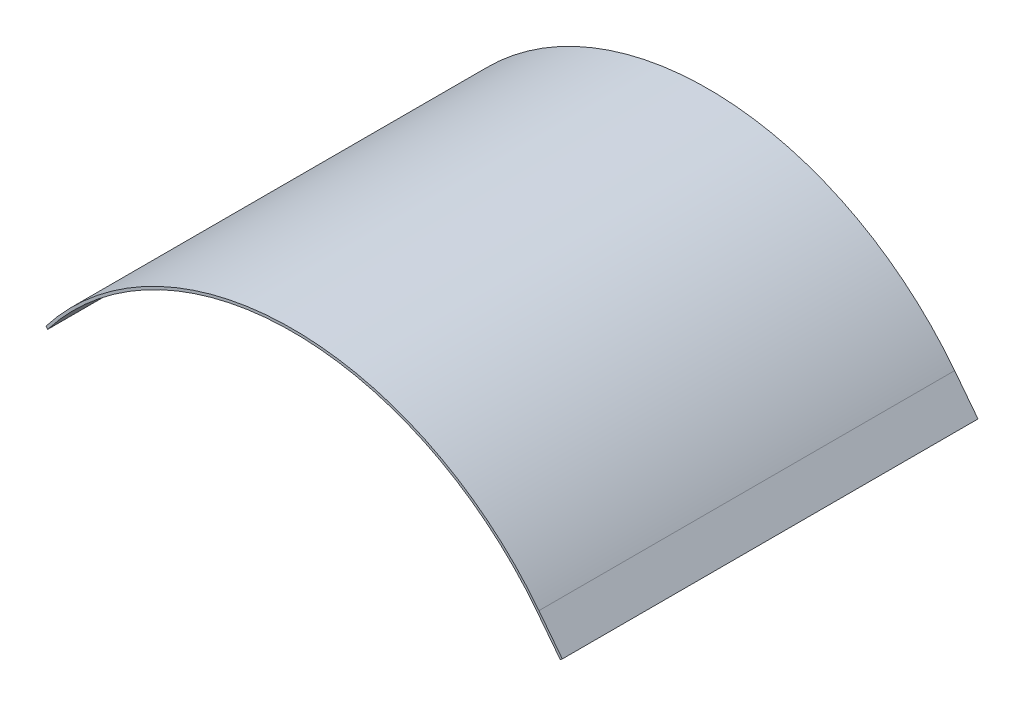
ISO-10303-21;
HEADER;
FILE_DESCRIPTION(('STEP AP214'),'2;1');
FILE_NAME('part.step','',(''),(''),'','','');
FILE_SCHEMA(('AUTOMOTIVE_DESIGN { 1 0 10303 214 1 1 1 1 }'));
ENDSEC;
DATA;
#1=APPLICATION_CONTEXT('core data for automotive mechanical design processes');
#2=APPLICATION_PROTOCOL_DEFINITION('international standard','automotive_design',2000,#1);
#3=PRODUCT_CONTEXT('',#1,'mechanical');
#4=PRODUCT('Part','Part','',(#3));
#5=PRODUCT_RELATED_PRODUCT_CATEGORY('part','',(#4));
#6=PRODUCT_DEFINITION_FORMATION('','',#4);
#7=PRODUCT_DEFINITION_CONTEXT('part definition',#1,'design');
#8=PRODUCT_DEFINITION('design','',#6,#7);
#9=PRODUCT_DEFINITION_SHAPE('','',#8);
#10=(LENGTH_UNIT() NAMED_UNIT(*) SI_UNIT(.MILLI.,.METRE.));
#11=(NAMED_UNIT(*) PLANE_ANGLE_UNIT() SI_UNIT($,.RADIAN.));
#12=(NAMED_UNIT(*) SI_UNIT($,.STERADIAN.) SOLID_ANGLE_UNIT());
#13=UNCERTAINTY_MEASURE_WITH_UNIT(LENGTH_MEASURE(1.E-05),#10,'distance_accuracy_value','');
#14=(GEOMETRIC_REPRESENTATION_CONTEXT(3) GLOBAL_UNCERTAINTY_ASSIGNED_CONTEXT((#13)) GLOBAL_UNIT_ASSIGNED_CONTEXT((#10,
#11,#12)) REPRESENTATION_CONTEXT('',''));
#15=CARTESIAN_POINT('',(0.,0.,0.));
#16=DIRECTION('',(0.,0.,1.));
#17=DIRECTION('',(1.,0.,0.));
#18=AXIS2_PLACEMENT_3D('',#15,#16,#17);
#19=CARTESIAN_POINT('',(0.,0.,1600.));
#20=DIRECTION('',(0.79057083333334,0.61237060468529,0.));
#21=DIRECTION('',(-0.61237060468529,0.79057083333334,0.));
#22=AXIS2_PLACEMENT_3D('',#19,#20,#21);
#23=PLANE('',#22);
#24=DIRECTION('',(0.61237060468529,-0.79057083333334,0.));
#25=VECTOR('',#24,1.);
#26=CARTESIAN_POINT('',(0.,0.,0.));
#27=LINE('',#26,#25);
#28=CARTESIAN_POINT('',(0.,0.,0.));
#29=VERTEX_POINT('',#28);
#30=CARTESIAN_POINT('',(6.32631661811814,-8.16727870745287,0.));
#31=VERTEX_POINT('',#30);
#32=EDGE_CURVE('E132',#29,#31,#27,.T.);
#33=ORIENTED_EDGE('',*,*,#32,.T.);
#34=DIRECTION('',(0.,0.,-1.));
#35=VECTOR('',#34,1.);
#36=CARTESIAN_POINT('',(6.32631661811814,-8.16727870745287,1600.));
#37=LINE('',#36,#35);
#38=CARTESIAN_POINT('',(6.32631661811814,-8.16727870745287,1600.));
#39=VERTEX_POINT('',#38);
#40=EDGE_CURVE('E11',#39,#31,#37,.T.);
#41=ORIENTED_EDGE('',*,*,#40,.F.);
#42=DIRECTION('',(0.61237060468529,-0.79057083333334,0.));
#43=VECTOR('',#42,1.);
#44=CARTESIAN_POINT('',(0.,0.,1600.));
#45=LINE('',#44,#43);
#46=CARTESIAN_POINT('',(0.,0.,1600.));
#47=VERTEX_POINT('',#46);
#48=EDGE_CURVE('E90',#47,#39,#45,.T.);
#49=ORIENTED_EDGE('',*,*,#48,.F.);
#50=DIRECTION('',(0.,0.,-1.));
#51=VECTOR('',#50,1.);
#52=CARTESIAN_POINT('',(0.,0.,1600.));
#53=LINE('',#52,#51);
#54=EDGE_CURVE('E56',#47,#29,#53,.T.);
#55=ORIENTED_EDGE('',*,*,#54,.T.);
#56=EDGE_LOOP('',(#33,#41,#49,#55));
#57=FACE_BOUND('',#56,.T.);
#58=ADVANCED_FACE('F39',(#57),#23,.F.);
#59=CARTESIAN_POINT('',(7.90570833333326,-6.12370604685308,1600.));
#60=DIRECTION('',(0.791234909195817,-0.611512320783389,0.));
#61=DIRECTION('',(0.611512320783389,0.791234909195817,0.));
#62=AXIS2_PLACEMENT_3D('',#59,#60,#61);
#63=PLANE('',#62);
#64=DIRECTION('',(-0.611512320783389,-0.791234909195817,0.));
#65=VECTOR('',#64,1.);
#66=CARTESIAN_POINT('',(7.90570833333326,-6.12370604685308,0.));
#67=LINE('',#66,#65);
#68=CARTESIAN_POINT('',(7.90570833333326,-6.12370604685308,0.));
#69=VERTEX_POINT('',#68);
#70=EDGE_CURVE('E135',#69,#31,#67,.T.);
#71=ORIENTED_EDGE('',*,*,#70,.F.);
#72=DIRECTION('',(0.,0.,-1.));
#73=VECTOR('',#72,1.);
#74=CARTESIAN_POINT('',(7.90570833333326,-6.12370604685308,1600.));
#75=LINE('',#74,#73);
#76=CARTESIAN_POINT('',(7.90570833333326,-6.12370604685308,1600.));
#77=VERTEX_POINT('',#76);
#78=EDGE_CURVE('E48',#77,#69,#75,.T.);
#79=ORIENTED_EDGE('',*,*,#78,.F.);
#80=DIRECTION('',(-0.611512320783389,-0.791234909195817,0.));
#81=VECTOR('',#80,1.);
#82=CARTESIAN_POINT('',(7.90570833333326,-6.12370604685308,1600.));
#83=LINE('',#82,#81);
#84=EDGE_CURVE('E178',#77,#39,#83,.T.);
#85=ORIENTED_EDGE('',*,*,#84,.T.);
#86=ORIENTED_EDGE('',*,*,#40,.T.);
#87=EDGE_LOOP('',(#71,#79,#85,#86));
#88=FACE_BOUND('',#87,.T.);
#89=ADVANCED_FACE('F177',(#88),#63,.T.);
#90=CARTESIAN_POINT('',(948.685,-734.844725622359,1600.));
#91=DIRECTION('',(0.,0.,-1.));
#92=DIRECTION('',(-1.,0.,0.));
#93=AXIS2_PLACEMENT_3D('',#90,#91,#92);
#94=CYLINDRICAL_SURFACE('',#93,1190.);
#95=CARTESIAN_POINT('',(948.685,-734.844725622359,0.));
#96=DIRECTION('',(0.,0.,-1.));
#97=DIRECTION('',(-1.,0.,0.));
#98=AXIS2_PLACEMENT_3D('',#95,#96,#97);
#99=CIRCLE('',#98,1190.);
#100=CARTESIAN_POINT('',(1889.46429166667,-6.12370604685297,0.));
#101=VERTEX_POINT('',#100);
#102=EDGE_CURVE('E139',#69,#101,#99,.T.);
#103=ORIENTED_EDGE('',*,*,#102,.T.);
#104=DIRECTION('',(0.,0.,-1.));
#105=VECTOR('',#104,1.);
#106=CARTESIAN_POINT('',(1889.46429166667,-6.12370604685297,1600.));
#107=LINE('',#106,#105);
#108=CARTESIAN_POINT('',(1889.46429166667,-6.12370604685297,1600.));
#109=VERTEX_POINT('',#108);
#110=EDGE_CURVE('E161',#109,#101,#107,.T.);
#111=ORIENTED_EDGE('',*,*,#110,.F.);
#112=CARTESIAN_POINT('',(948.685,-734.844725622359,1600.));
#113=DIRECTION('',(0.,0.,-1.));
#114=DIRECTION('',(-1.,0.,0.));
#115=AXIS2_PLACEMENT_3D('',#112,#113,#114);
#116=CIRCLE('',#115,1190.);
#117=EDGE_CURVE('E170',#77,#109,#116,.T.);
#118=ORIENTED_EDGE('',*,*,#117,.F.);
#119=ORIENTED_EDGE('',*,*,#78,.T.);
#120=EDGE_LOOP('',(#103,#111,#118,#119));
#121=FACE_BOUND('',#120,.T.);
#122=ADVANCED_FACE('F168',(#121),#94,.F.);
#123=CARTESIAN_POINT('',(1889.46429166667,-6.12370604685297,1600.));
#124=DIRECTION('',(0.790570833333333,0.612370604685299,0.));
#125=DIRECTION('',(-0.612370604685299,0.790570833333333,0.));
#126=AXIS2_PLACEMENT_3D('',#123,#124,#125);
#127=PLANE('',#126);
#128=DIRECTION('',(0.612370604685299,-0.790570833333333,0.));
#129=VECTOR('',#128,1.);
#130=CARTESIAN_POINT('',(1889.46429166667,-6.12370604685297,0.));
#131=LINE('',#130,#129);
#132=CARTESIAN_POINT('',(1979.4031623768,-122.23484433852,0.));
#133=VERTEX_POINT('',#132);
#134=EDGE_CURVE('E142',#101,#133,#131,.T.);
#135=ORIENTED_EDGE('',*,*,#134,.T.);
#136=DIRECTION('',(0.,0.,-1.));
#137=VECTOR('',#136,1.);
#138=CARTESIAN_POINT('',(1979.4031623768,-122.23484433852,1600.));
#139=LINE('',#138,#137);
#140=CARTESIAN_POINT('',(1979.4031623768,-122.23484433852,1600.));
#141=VERTEX_POINT('',#140);
#142=EDGE_CURVE('E114',#141,#133,#139,.T.);
#143=ORIENTED_EDGE('',*,*,#142,.F.);
#144=DIRECTION('',(0.612370604685299,-0.790570833333333,0.));
#145=VECTOR('',#144,1.);
#146=CARTESIAN_POINT('',(1889.46429166667,-6.12370604685297,1600.));
#147=LINE('',#146,#145);
#148=EDGE_CURVE('E120',#109,#141,#147,.T.);
#149=ORIENTED_EDGE('',*,*,#148,.F.);
#150=ORIENTED_EDGE('',*,*,#110,.T.);
#151=EDGE_LOOP('',(#135,#143,#149,#150));
#152=FACE_BOUND('',#151,.T.);
#153=ADVANCED_FACE('F196',(#152),#127,.F.);
#154=CARTESIAN_POINT('',(1987.30887071013,-116.111138291667,1600.));
#155=DIRECTION('',(0.612370604685296,-0.790570833333336,0.));
#156=DIRECTION('',(0.790570833333336,0.612370604685296,0.));
#157=AXIS2_PLACEMENT_3D('',#154,#155,#156);
#158=PLANE('',#157);
#159=DIRECTION('',(-0.790570833333336,-0.612370604685296,0.));
#160=VECTOR('',#159,1.);
#161=CARTESIAN_POINT('',(1987.30887071013,-116.111138291667,0.));
#162=LINE('',#161,#160);
#163=CARTESIAN_POINT('',(1987.30887071013,-116.111138291667,0.));
#164=VERTEX_POINT('',#163);
#165=EDGE_CURVE('E109',#164,#133,#162,.T.);
#166=ORIENTED_EDGE('',*,*,#165,.F.);
#167=DIRECTION('',(0.,0.,-1.));
#168=VECTOR('',#167,1.);
#169=CARTESIAN_POINT('',(1987.30887071013,-116.111138291667,1600.));
#170=LINE('',#169,#168);
#171=CARTESIAN_POINT('',(1987.30887071013,-116.111138291667,1600.));
#172=VERTEX_POINT('',#171);
#173=EDGE_CURVE('E104',#172,#164,#170,.T.);
#174=ORIENTED_EDGE('',*,*,#173,.F.);
#175=DIRECTION('',(-0.790570833333336,-0.612370604685296,0.));
#176=VECTOR('',#175,1.);
#177=CARTESIAN_POINT('',(1987.30887071013,-116.111138291667,1600.));
#178=LINE('',#177,#176);
#179=EDGE_CURVE('E107',#172,#141,#178,.T.);
#180=ORIENTED_EDGE('',*,*,#179,.T.);
#181=ORIENTED_EDGE('',*,*,#142,.T.);
#182=EDGE_LOOP('',(#166,#174,#180,#181));
#183=FACE_BOUND('',#182,.T.);
#184=ADVANCED_FACE('F106',(#183),#158,.T.);
#185=CARTESIAN_POINT('',(1897.37,0.,1600.));
#186=DIRECTION('',(0.790570833333333,0.612370604685299,0.));
#187=DIRECTION('',(-0.612370604685299,0.790570833333333,0.));
#188=AXIS2_PLACEMENT_3D('',#185,#186,#187);
#189=PLANE('',#188);
#190=DIRECTION('',(0.612370604685299,-0.790570833333333,0.));
#191=VECTOR('',#190,1.);
#192=CARTESIAN_POINT('',(1897.37,0.,0.));
#193=LINE('',#192,#191);
#194=CARTESIAN_POINT('',(1897.37,-1.11022302462516E-13,0.));
#195=VERTEX_POINT('',#194);
#196=EDGE_CURVE('E148',#195,#164,#193,.T.);
#197=ORIENTED_EDGE('',*,*,#196,.F.);
#198=DIRECTION('',(0.,0.,-1.));
#199=VECTOR('',#198,1.);
#200=CARTESIAN_POINT('',(1897.37,-1.11022302462516E-13,1600.));
#201=LINE('',#200,#199);
#202=CARTESIAN_POINT('',(1897.37,-1.11022302462516E-13,1600.));
#203=VERTEX_POINT('',#202);
#204=EDGE_CURVE('E78',#203,#195,#201,.T.);
#205=ORIENTED_EDGE('',*,*,#204,.F.);
#206=DIRECTION('',(0.612370604685299,-0.790570833333333,0.));
#207=VECTOR('',#206,1.);
#208=CARTESIAN_POINT('',(1897.37,0.,1600.));
#209=LINE('',#208,#207);
#210=EDGE_CURVE('E118',#203,#172,#209,.T.);
#211=ORIENTED_EDGE('',*,*,#210,.T.);
#212=ORIENTED_EDGE('',*,*,#173,.T.);
#213=EDGE_LOOP('',(#197,#205,#211,#212));
#214=FACE_BOUND('',#213,.T.);
#215=ADVANCED_FACE('F124',(#214),#189,.T.);
#216=CARTESIAN_POINT('',(948.685,-734.844725622359,1600.));
#217=DIRECTION('',(0.,0.,-1.));
#218=DIRECTION('',(-1.,0.,0.));
#219=AXIS2_PLACEMENT_3D('',#216,#217,#218);
#220=CYLINDRICAL_SURFACE('',#219,1200.);
#221=CARTESIAN_POINT('',(948.685,-734.844725622359,0.));
#222=DIRECTION('',(0.,0.,-1.));
#223=DIRECTION('',(-1.,0.,0.));
#224=AXIS2_PLACEMENT_3D('',#221,#222,#223);
#225=CIRCLE('',#224,1200.);
#226=EDGE_CURVE('E151',#29,#195,#225,.T.);
#227=ORIENTED_EDGE('',*,*,#226,.F.);
#228=ORIENTED_EDGE('',*,*,#54,.F.);
#229=CARTESIAN_POINT('',(948.685,-734.844725622359,1600.));
#230=DIRECTION('',(0.,0.,-1.));
#231=DIRECTION('',(-1.,0.,0.));
#232=AXIS2_PLACEMENT_3D('',#229,#230,#231);
#233=CIRCLE('',#232,1200.);
#234=EDGE_CURVE('E126',#47,#203,#233,.T.);
#235=ORIENTED_EDGE('',*,*,#234,.T.);
#236=ORIENTED_EDGE('',*,*,#204,.T.);
#237=EDGE_LOOP('',(#227,#228,#235,#236));
#238=FACE_BOUND('',#237,.T.);
#239=ADVANCED_FACE('F179',(#238),#220,.T.);
#240=CARTESIAN_POINT('',(948.685,-734.844725622359,1600.));
#241=DIRECTION('',(0.,0.,-1.));
#242=DIRECTION('',(-1.,0.,0.));
#243=AXIS2_PLACEMENT_3D('',#240,#241,#242);
#244=PLANE('',#243);
#245=ORIENTED_EDGE('',*,*,#48,.T.);
#246=ORIENTED_EDGE('',*,*,#84,.F.);
#247=ORIENTED_EDGE('',*,*,#117,.T.);
#248=ORIENTED_EDGE('',*,*,#148,.T.);
#249=ORIENTED_EDGE('',*,*,#179,.F.);
#250=ORIENTED_EDGE('',*,*,#210,.F.);
#251=ORIENTED_EDGE('',*,*,#234,.F.);
#252=EDGE_LOOP('',(#245,#246,#247,#248,#249,#250,#251));
#253=FACE_BOUND('',#252,.T.);
#254=ADVANCED_FACE('F117',(#253),#244,.F.);
#255=CARTESIAN_POINT('',(948.685,-734.844725622359,0.));
#256=DIRECTION('',(0.,0.,-1.));
#257=DIRECTION('',(-1.,0.,0.));
#258=AXIS2_PLACEMENT_3D('',#255,#256,#257);
#259=PLANE('',#258);
#260=ORIENTED_EDGE('',*,*,#32,.F.);
#261=ORIENTED_EDGE('',*,*,#226,.T.);
#262=ORIENTED_EDGE('',*,*,#196,.T.);
#263=ORIENTED_EDGE('',*,*,#165,.T.);
#264=ORIENTED_EDGE('',*,*,#134,.F.);
#265=ORIENTED_EDGE('',*,*,#102,.F.);
#266=ORIENTED_EDGE('',*,*,#70,.T.);
#267=EDGE_LOOP('',(#260,#261,#262,#263,#264,#265,#266));
#268=FACE_BOUND('',#267,.T.);
#269=ADVANCED_FACE('F176',(#268),#259,.T.);
#270=CLOSED_SHELL('',(#58,#89,#122,#153,#184,#215,#239,#254,#269));
#271=MANIFOLD_SOLID_BREP('B2',#270);
#272=ADVANCED_BREP_SHAPE_REPRESENTATION('',(#18,#271),#14);
#273=SHAPE_DEFINITION_REPRESENTATION(#9,#272);
ENDSEC;
END-ISO-10303-21;
